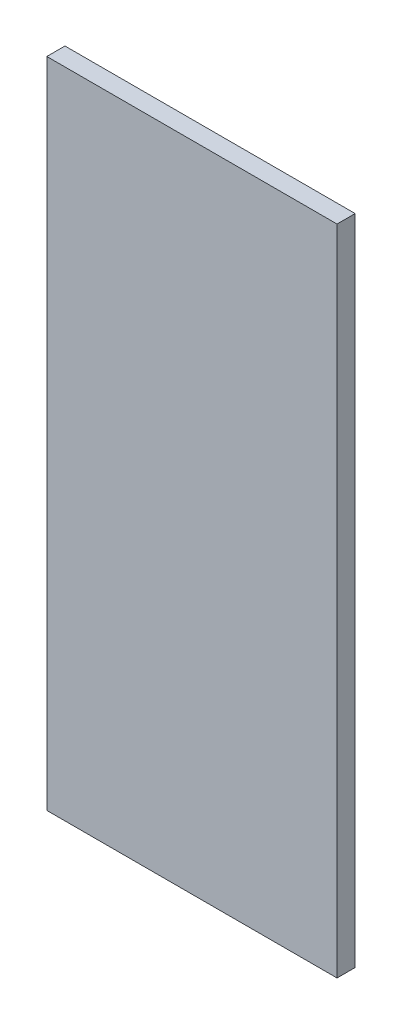
ISO-10303-21;
HEADER;
FILE_DESCRIPTION(('STEP AP214'),'2;1');
FILE_NAME('part.step','',(''),(''),'','','');
FILE_SCHEMA(('AUTOMOTIVE_DESIGN { 1 0 10303 214 1 1 1 1 }'));
ENDSEC;
DATA;
#1=APPLICATION_CONTEXT('core data for automotive mechanical design processes');
#2=APPLICATION_PROTOCOL_DEFINITION('international standard','automotive_design',2000,#1);
#3=PRODUCT_CONTEXT('',#1,'mechanical');
#4=PRODUCT('Part','Part','',(#3));
#5=PRODUCT_RELATED_PRODUCT_CATEGORY('part','',(#4));
#6=PRODUCT_DEFINITION_FORMATION('','',#4);
#7=PRODUCT_DEFINITION_CONTEXT('part definition',#1,'design');
#8=PRODUCT_DEFINITION('design','',#6,#7);
#9=PRODUCT_DEFINITION_SHAPE('','',#8);
#10=(LENGTH_UNIT() NAMED_UNIT(*) SI_UNIT(.MILLI.,.METRE.));
#11=(NAMED_UNIT(*) PLANE_ANGLE_UNIT() SI_UNIT($,.RADIAN.));
#12=(NAMED_UNIT(*) SI_UNIT($,.STERADIAN.) SOLID_ANGLE_UNIT());
#13=UNCERTAINTY_MEASURE_WITH_UNIT(LENGTH_MEASURE(1.E-05),#10,'distance_accuracy_value','');
#14=(GEOMETRIC_REPRESENTATION_CONTEXT(3) GLOBAL_UNCERTAINTY_ASSIGNED_CONTEXT((#13)) GLOBAL_UNIT_ASSIGNED_CONTEXT((#10,
#11,#12)) REPRESENTATION_CONTEXT('',''));
#15=CARTESIAN_POINT('',(0.,0.,0.));
#16=DIRECTION('',(0.,0.,1.));
#17=DIRECTION('',(1.,0.,0.));
#18=AXIS2_PLACEMENT_3D('',#15,#16,#17);
#19=CARTESIAN_POINT('',(0.,0.,3.175));
#20=DIRECTION('',(1.,0.,0.));
#21=DIRECTION('',(0.,0.,-1.));
#22=AXIS2_PLACEMENT_3D('',#19,#20,#21);
#23=PLANE('',#22);
#24=DIRECTION('',(0.,-1.,0.));
#25=VECTOR('',#24,1.);
#26=CARTESIAN_POINT('',(0.,0.,0.));
#27=LINE('',#26,#25);
#28=CARTESIAN_POINT('',(0.,114.3,0.));
#29=VERTEX_POINT('',#28);
#30=CARTESIAN_POINT('',(0.,0.,0.));
#31=VERTEX_POINT('',#30);
#32=EDGE_CURVE('E95',#29,#31,#27,.T.);
#33=ORIENTED_EDGE('',*,*,#32,.T.);
#34=DIRECTION('',(0.,0.,-1.));
#35=VECTOR('',#34,1.);
#36=CARTESIAN_POINT('',(0.,0.,3.175));
#37=LINE('',#36,#35);
#38=CARTESIAN_POINT('',(0.,0.,3.175));
#39=VERTEX_POINT('',#38);
#40=EDGE_CURVE('E11',#39,#31,#37,.T.);
#41=ORIENTED_EDGE('',*,*,#40,.F.);
#42=DIRECTION('',(0.,-1.,0.));
#43=VECTOR('',#42,1.);
#44=CARTESIAN_POINT('',(0.,0.,3.175));
#45=LINE('',#44,#43);
#46=CARTESIAN_POINT('',(0.,114.3,3.175));
#47=VERTEX_POINT('',#46);
#48=EDGE_CURVE('E83',#47,#39,#45,.T.);
#49=ORIENTED_EDGE('',*,*,#48,.F.);
#50=DIRECTION('',(0.,0.,-1.));
#51=VECTOR('',#50,1.);
#52=CARTESIAN_POINT('',(0.,114.3,3.175));
#53=LINE('',#52,#51);
#54=EDGE_CURVE('E91',#47,#29,#53,.T.);
#55=ORIENTED_EDGE('',*,*,#54,.T.);
#56=EDGE_LOOP('',(#33,#41,#49,#55));
#57=FACE_BOUND('',#56,.T.);
#58=ADVANCED_FACE('F32',(#57),#23,.F.);
#59=CARTESIAN_POINT('',(0.,0.,3.175));
#60=DIRECTION('',(0.,1.,0.));
#61=DIRECTION('',(0.,0.,1.));
#62=AXIS2_PLACEMENT_3D('',#59,#60,#61);
#63=PLANE('',#62);
#64=DIRECTION('',(1.,0.,0.));
#65=VECTOR('',#64,1.);
#66=CARTESIAN_POINT('',(0.,0.,0.));
#67=LINE('',#66,#65);
#68=CARTESIAN_POINT('',(50.8,0.,0.));
#69=VERTEX_POINT('',#68);
#70=EDGE_CURVE('E87',#31,#69,#67,.T.);
#71=ORIENTED_EDGE('',*,*,#70,.T.);
#72=DIRECTION('',(0.,0.,-1.));
#73=VECTOR('',#72,1.);
#74=CARTESIAN_POINT('',(50.8,0.,3.175));
#75=LINE('',#74,#73);
#76=CARTESIAN_POINT('',(50.8,0.,3.175));
#77=VERTEX_POINT('',#76);
#78=EDGE_CURVE('E40',#77,#69,#75,.T.);
#79=ORIENTED_EDGE('',*,*,#78,.F.);
#80=DIRECTION('',(1.,0.,0.));
#81=VECTOR('',#80,1.);
#82=CARTESIAN_POINT('',(0.,0.,3.175));
#83=LINE('',#82,#81);
#84=EDGE_CURVE('E78',#39,#77,#83,.T.);
#85=ORIENTED_EDGE('',*,*,#84,.F.);
#86=ORIENTED_EDGE('',*,*,#40,.T.);
#87=EDGE_LOOP('',(#71,#79,#85,#86));
#88=FACE_BOUND('',#87,.T.);
#89=ADVANCED_FACE('F86',(#88),#63,.F.);
#90=CARTESIAN_POINT('',(50.8,0.,3.175));
#91=DIRECTION('',(-1.,0.,0.));
#92=DIRECTION('',(0.,0.,1.));
#93=AXIS2_PLACEMENT_3D('',#90,#91,#92);
#94=PLANE('',#93);
#95=DIRECTION('',(0.,1.,0.));
#96=VECTOR('',#95,1.);
#97=CARTESIAN_POINT('',(50.8,0.,0.));
#98=LINE('',#97,#96);
#99=CARTESIAN_POINT('',(50.8,114.3,0.));
#100=VERTEX_POINT('',#99);
#101=EDGE_CURVE('E65',#69,#100,#98,.T.);
#102=ORIENTED_EDGE('',*,*,#101,.T.);
#103=DIRECTION('',(0.,0.,-1.));
#104=VECTOR('',#103,1.);
#105=CARTESIAN_POINT('',(50.8,114.3,3.175));
#106=LINE('',#105,#104);
#107=CARTESIAN_POINT('',(50.8,114.3,3.175));
#108=VERTEX_POINT('',#107);
#109=EDGE_CURVE('E88',#108,#100,#106,.T.);
#110=ORIENTED_EDGE('',*,*,#109,.F.);
#111=DIRECTION('',(0.,1.,0.));
#112=VECTOR('',#111,1.);
#113=CARTESIAN_POINT('',(50.8,0.,3.175));
#114=LINE('',#113,#112);
#115=EDGE_CURVE('E81',#77,#108,#114,.T.);
#116=ORIENTED_EDGE('',*,*,#115,.F.);
#117=ORIENTED_EDGE('',*,*,#78,.T.);
#118=EDGE_LOOP('',(#102,#110,#116,#117));
#119=FACE_BOUND('',#118,.T.);
#120=ADVANCED_FACE('F89',(#119),#94,.F.);
#121=CARTESIAN_POINT('',(0.,114.3,3.175));
#122=DIRECTION('',(0.,-1.,0.));
#123=DIRECTION('',(0.,0.,-1.));
#124=AXIS2_PLACEMENT_3D('',#121,#122,#123);
#125=PLANE('',#124);
#126=DIRECTION('',(-1.,0.,0.));
#127=VECTOR('',#126,1.);
#128=CARTESIAN_POINT('',(0.,114.3,0.));
#129=LINE('',#128,#127);
#130=EDGE_CURVE('E71',#100,#29,#129,.T.);
#131=ORIENTED_EDGE('',*,*,#130,.T.);
#132=ORIENTED_EDGE('',*,*,#54,.F.);
#133=DIRECTION('',(-1.,0.,0.));
#134=VECTOR('',#133,1.);
#135=CARTESIAN_POINT('',(0.,114.3,3.175));
#136=LINE('',#135,#134);
#137=EDGE_CURVE('E48',#108,#47,#136,.T.);
#138=ORIENTED_EDGE('',*,*,#137,.F.);
#139=ORIENTED_EDGE('',*,*,#109,.T.);
#140=EDGE_LOOP('',(#131,#132,#138,#139));
#141=FACE_BOUND('',#140,.T.);
#142=ADVANCED_FACE('F102',(#141),#125,.F.);
#143=CARTESIAN_POINT('',(0.,0.,3.175));
#144=DIRECTION('',(0.,0.,-1.));
#145=DIRECTION('',(-1.,0.,0.));
#146=AXIS2_PLACEMENT_3D('',#143,#144,#145);
#147=PLANE('',#146);
#148=ORIENTED_EDGE('',*,*,#48,.T.);
#149=ORIENTED_EDGE('',*,*,#84,.T.);
#150=ORIENTED_EDGE('',*,*,#115,.T.);
#151=ORIENTED_EDGE('',*,*,#137,.T.);
#152=EDGE_LOOP('',(#148,#149,#150,#151));
#153=FACE_BOUND('',#152,.T.);
#154=ADVANCED_FACE('F79',(#153),#147,.F.);
#155=CARTESIAN_POINT('',(0.,0.,0.));
#156=DIRECTION('',(0.,0.,-1.));
#157=DIRECTION('',(-1.,0.,0.));
#158=AXIS2_PLACEMENT_3D('',#155,#156,#157);
#159=PLANE('',#158);
#160=ORIENTED_EDGE('',*,*,#32,.F.);
#161=ORIENTED_EDGE('',*,*,#130,.F.);
#162=ORIENTED_EDGE('',*,*,#101,.F.);
#163=ORIENTED_EDGE('',*,*,#70,.F.);
#164=EDGE_LOOP('',(#160,#161,#162,#163));
#165=FACE_BOUND('',#164,.T.);
#166=ADVANCED_FACE('F105',(#165),#159,.T.);
#167=CLOSED_SHELL('',(#58,#89,#120,#142,#154,#166));
#168=MANIFOLD_SOLID_BREP('B2',#167);
#169=ADVANCED_BREP_SHAPE_REPRESENTATION('',(#18,#168),#14);
#170=SHAPE_DEFINITION_REPRESENTATION(#9,#169);
ENDSEC;
END-ISO-10303-21;
